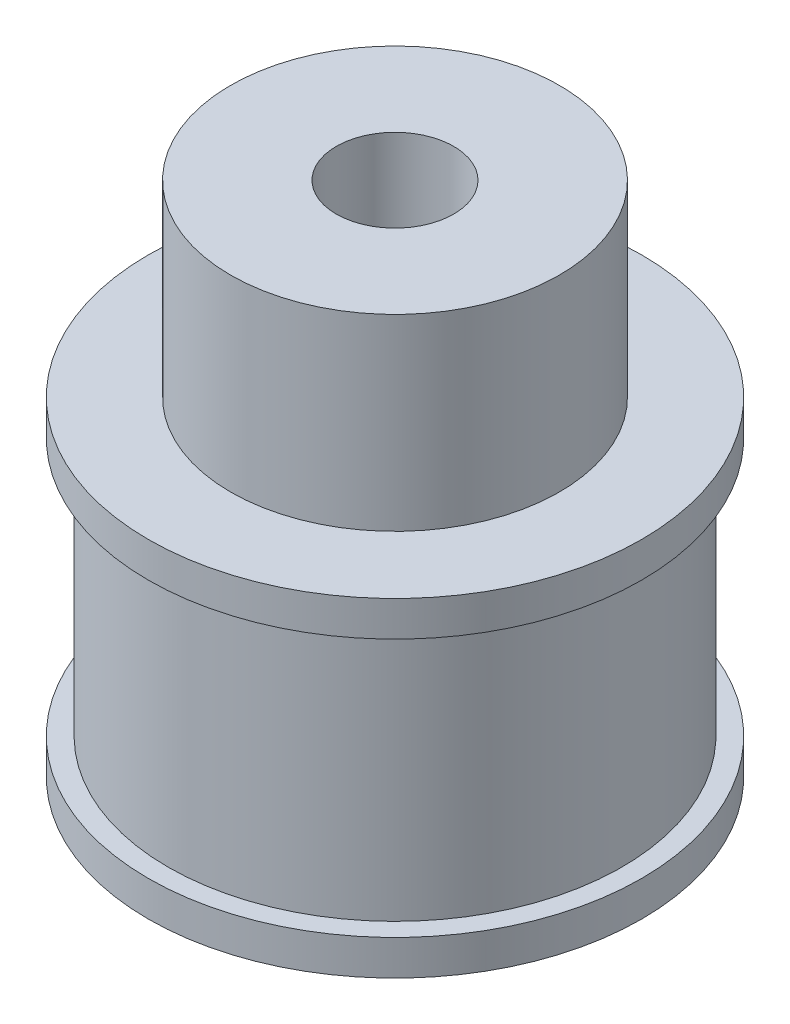
ISO-10303-21;
HEADER;
FILE_DESCRIPTION(('STEP AP214'),'2;1');
FILE_NAME('part.step','',(''),(''),'','','');
FILE_SCHEMA(('AUTOMOTIVE_DESIGN { 1 0 10303 214 1 1 1 1 }'));
ENDSEC;
DATA;
#1=APPLICATION_CONTEXT('core data for automotive mechanical design processes');
#2=APPLICATION_PROTOCOL_DEFINITION('international standard','automotive_design',2000,#1);
#3=PRODUCT_CONTEXT('',#1,'mechanical');
#4=PRODUCT('Part','Part','',(#3));
#5=PRODUCT_RELATED_PRODUCT_CATEGORY('part','',(#4));
#6=PRODUCT_DEFINITION_FORMATION('','',#4);
#7=PRODUCT_DEFINITION_CONTEXT('part definition',#1,'design');
#8=PRODUCT_DEFINITION('design','',#6,#7);
#9=PRODUCT_DEFINITION_SHAPE('','',#8);
#10=(LENGTH_UNIT() NAMED_UNIT(*) SI_UNIT(.MILLI.,.METRE.));
#11=(NAMED_UNIT(*) PLANE_ANGLE_UNIT() SI_UNIT($,.RADIAN.));
#12=(NAMED_UNIT(*) SI_UNIT($,.STERADIAN.) SOLID_ANGLE_UNIT());
#13=UNCERTAINTY_MEASURE_WITH_UNIT(LENGTH_MEASURE(1.E-05),#10,'distance_accuracy_value','');
#14=(GEOMETRIC_REPRESENTATION_CONTEXT(3) GLOBAL_UNCERTAINTY_ASSIGNED_CONTEXT((#13)) GLOBAL_UNIT_ASSIGNED_CONTEXT((#10,
#11,#12)) REPRESENTATION_CONTEXT('',''));
#15=CARTESIAN_POINT('',(0.,0.,0.));
#16=DIRECTION('',(0.,0.,1.));
#17=DIRECTION('',(1.,0.,0.));
#18=AXIS2_PLACEMENT_3D('',#15,#16,#17);
#19=CARTESIAN_POINT('',(0.,14.,0.));
#20=DIRECTION('',(0.,-1.,0.));
#21=DIRECTION('',(0.,0.,-1.));
#22=AXIS2_PLACEMENT_3D('',#19,#20,#21);
#23=CYLINDRICAL_SURFACE('',#22,10.5);
#24=CARTESIAN_POINT('',(0.,0.,0.));
#25=DIRECTION('',(0.,1.,0.));
#26=DIRECTION('',(0.,0.,1.));
#27=AXIS2_PLACEMENT_3D('',#24,#25,#26);
#28=CIRCLE('',#27,10.5);
#29=CARTESIAN_POINT('',(0.,0.,10.5));
#30=VERTEX_POINT('',#29);
#31=EDGE_CURVE('E44',#30,#30,#28,.T.);
#32=ORIENTED_EDGE('',*,*,#31,.T.);
#33=EDGE_LOOP('',(#32));
#34=FACE_BOUND('',#33,.T.);
#35=CARTESIAN_POINT('',(0.,1.5,0.));
#36=DIRECTION('',(0.,1.,0.));
#37=DIRECTION('',(0.,0.,1.));
#38=AXIS2_PLACEMENT_3D('',#35,#36,#37);
#39=CIRCLE('',#38,10.5);
#40=CARTESIAN_POINT('',(0.,1.5,10.5));
#41=VERTEX_POINT('',#40);
#42=EDGE_CURVE('E51',#41,#41,#39,.T.);
#43=ORIENTED_EDGE('',*,*,#42,.F.);
#44=EDGE_LOOP('',(#43));
#45=FACE_BOUND('',#44,.T.);
#46=ADVANCED_FACE('F31',(#34,#45),#23,.T.);
#47=CARTESIAN_POINT('',(0.,12.5,0.));
#48=DIRECTION('',(0.,1.,0.));
#49=DIRECTION('',(0.,0.,1.));
#50=AXIS2_PLACEMENT_3D('',#47,#48,#49);
#51=CIRCLE('',#50,10.5);
#52=CARTESIAN_POINT('',(0.,12.5,10.5));
#53=VERTEX_POINT('',#52);
#54=EDGE_CURVE('E35',#53,#53,#51,.T.);
#55=ORIENTED_EDGE('',*,*,#54,.T.);
#56=EDGE_LOOP('',(#55));
#57=FACE_BOUND('',#56,.T.);
#58=CARTESIAN_POINT('',(0.,14.,0.));
#59=DIRECTION('',(0.,1.,0.));
#60=DIRECTION('',(0.,0.,1.));
#61=AXIS2_PLACEMENT_3D('',#58,#59,#60);
#62=CIRCLE('',#61,10.5);
#63=CARTESIAN_POINT('',(0.,14.,10.5));
#64=VERTEX_POINT('',#63);
#65=EDGE_CURVE('E39',#64,#64,#62,.T.);
#66=ORIENTED_EDGE('',*,*,#65,.F.);
#67=EDGE_LOOP('',(#66));
#68=FACE_BOUND('',#67,.T.);
#69=ADVANCED_FACE('F33',(#57,#68),#23,.T.);
#70=CARTESIAN_POINT('',(0.,14.,0.));
#71=DIRECTION('',(0.,1.,0.));
#72=DIRECTION('',(0.,0.,1.));
#73=AXIS2_PLACEMENT_3D('',#70,#71,#72);
#74=PLANE('',#73);
#75=CARTESIAN_POINT('',(0.,14.,0.));
#76=DIRECTION('',(0.,1.,0.));
#77=DIRECTION('',(0.,0.,1.));
#78=AXIS2_PLACEMENT_3D('',#75,#76,#77);
#79=CIRCLE('',#78,7.);
#80=CARTESIAN_POINT('',(0.,14.,7.));
#81=VERTEX_POINT('',#80);
#82=EDGE_CURVE('E11',#81,#81,#79,.T.);
#83=ORIENTED_EDGE('',*,*,#82,.F.);
#84=EDGE_LOOP('',(#83));
#85=FACE_BOUND('',#84,.T.);
#86=ORIENTED_EDGE('',*,*,#65,.T.);
#87=EDGE_LOOP('',(#86));
#88=FACE_BOUND('',#87,.T.);
#89=ADVANCED_FACE('F87',(#85,#88),#74,.T.);
#90=CARTESIAN_POINT('',(0.,0.,0.));
#91=DIRECTION('',(0.,1.,0.));
#92=DIRECTION('',(0.,0.,1.));
#93=AXIS2_PLACEMENT_3D('',#90,#91,#92);
#94=PLANE('',#93);
#95=CARTESIAN_POINT('',(0.,0.,0.));
#96=DIRECTION('',(0.,1.,0.));
#97=DIRECTION('',(0.,0.,1.));
#98=AXIS2_PLACEMENT_3D('',#95,#96,#97);
#99=CIRCLE('',#98,2.5);
#100=CARTESIAN_POINT('',(0.,0.,2.5));
#101=VERTEX_POINT('',#100);
#102=EDGE_CURVE('E66',#101,#101,#99,.T.);
#103=ORIENTED_EDGE('',*,*,#102,.T.);
#104=EDGE_LOOP('',(#103));
#105=FACE_BOUND('',#104,.T.);
#106=ORIENTED_EDGE('',*,*,#31,.F.);
#107=EDGE_LOOP('',(#106));
#108=FACE_BOUND('',#107,.T.);
#109=ADVANCED_FACE('F82',(#105,#108),#94,.F.);
#110=CARTESIAN_POINT('',(0.,22.,0.));
#111=DIRECTION('',(0.,-1.,0.));
#112=DIRECTION('',(0.,0.,-1.));
#113=AXIS2_PLACEMENT_3D('',#110,#111,#112);
#114=CYLINDRICAL_SURFACE('',#113,7.);
#115=CARTESIAN_POINT('',(0.,22.,0.));
#116=DIRECTION('',(0.,1.,0.));
#117=DIRECTION('',(0.,0.,1.));
#118=AXIS2_PLACEMENT_3D('',#115,#116,#117);
#119=CIRCLE('',#118,7.);
#120=CARTESIAN_POINT('',(0.,22.,7.));
#121=VERTEX_POINT('',#120);
#122=EDGE_CURVE('E47',#121,#121,#119,.T.);
#123=ORIENTED_EDGE('',*,*,#122,.F.);
#124=EDGE_LOOP('',(#123));
#125=FACE_BOUND('',#124,.T.);
#126=ORIENTED_EDGE('',*,*,#82,.T.);
#127=EDGE_LOOP('',(#126));
#128=FACE_BOUND('',#127,.T.);
#129=ADVANCED_FACE('F76',(#125,#128),#114,.T.);
#130=CARTESIAN_POINT('',(0.,22.,0.));
#131=DIRECTION('',(0.,1.,0.));
#132=DIRECTION('',(0.,0.,1.));
#133=AXIS2_PLACEMENT_3D('',#130,#131,#132);
#134=PLANE('',#133);
#135=CARTESIAN_POINT('',(0.,22.,0.));
#136=DIRECTION('',(0.,1.,0.));
#137=DIRECTION('',(0.,0.,1.));
#138=AXIS2_PLACEMENT_3D('',#135,#136,#137);
#139=CIRCLE('',#138,2.5);
#140=CARTESIAN_POINT('',(0.,22.,2.5));
#141=VERTEX_POINT('',#140);
#142=EDGE_CURVE('E57',#141,#141,#139,.T.);
#143=ORIENTED_EDGE('',*,*,#142,.F.);
#144=EDGE_LOOP('',(#143));
#145=FACE_BOUND('',#144,.T.);
#146=ORIENTED_EDGE('',*,*,#122,.T.);
#147=EDGE_LOOP('',(#146));
#148=FACE_BOUND('',#147,.T.);
#149=ADVANCED_FACE('F73',(#145,#148),#134,.T.);
#150=CARTESIAN_POINT('',(0.,0.,0.));
#151=DIRECTION('',(0.,1.,0.));
#152=DIRECTION('',(0.,0.,1.));
#153=AXIS2_PLACEMENT_3D('',#150,#151,#152);
#154=CYLINDRICAL_SURFACE('',#153,2.5);
#155=ORIENTED_EDGE('',*,*,#102,.F.);
#156=EDGE_LOOP('',(#155));
#157=FACE_BOUND('',#156,.T.);
#158=ORIENTED_EDGE('',*,*,#142,.T.);
#159=EDGE_LOOP('',(#158));
#160=FACE_BOUND('',#159,.T.);
#161=ADVANCED_FACE('F71',(#157,#160),#154,.F.);
#162=CARTESIAN_POINT('',(0.,12.5,0.));
#163=DIRECTION('',(0.,1.,0.));
#164=DIRECTION('',(0.,0.,1.));
#165=AXIS2_PLACEMENT_3D('',#162,#163,#164);
#166=PLANE('',#165);
#167=CARTESIAN_POINT('',(0.,12.5,0.));
#168=DIRECTION('',(0.,1.,0.));
#169=DIRECTION('',(0.,0.,1.));
#170=AXIS2_PLACEMENT_3D('',#167,#168,#169);
#171=CIRCLE('',#170,9.6623253001789);
#172=CARTESIAN_POINT('',(0.,12.5,9.6623253001789));
#173=VERTEX_POINT('',#172);
#174=EDGE_CURVE('E53',#173,#173,#171,.T.);
#175=ORIENTED_EDGE('',*,*,#174,.T.);
#176=EDGE_LOOP('',(#175));
#177=FACE_BOUND('',#176,.T.);
#178=ORIENTED_EDGE('',*,*,#54,.F.);
#179=EDGE_LOOP('',(#178));
#180=FACE_BOUND('',#179,.T.);
#181=ADVANCED_FACE('F108',(#177,#180),#166,.F.);
#182=CARTESIAN_POINT('',(0.,1.5,0.));
#183=DIRECTION('',(0.,1.,0.));
#184=DIRECTION('',(0.,0.,1.));
#185=AXIS2_PLACEMENT_3D('',#182,#183,#184);
#186=PLANE('',#185);
#187=CARTESIAN_POINT('',(0.,1.5,0.));
#188=DIRECTION('',(0.,1.,0.));
#189=DIRECTION('',(0.,0.,1.));
#190=AXIS2_PLACEMENT_3D('',#187,#188,#189);
#191=CIRCLE('',#190,9.6623253001789);
#192=CARTESIAN_POINT('',(0.,1.5,9.6623253001789));
#193=VERTEX_POINT('',#192);
#194=EDGE_CURVE('E59',#193,#193,#191,.T.);
#195=ORIENTED_EDGE('',*,*,#194,.F.);
#196=EDGE_LOOP('',(#195));
#197=FACE_BOUND('',#196,.T.);
#198=ORIENTED_EDGE('',*,*,#42,.T.);
#199=EDGE_LOOP('',(#198));
#200=FACE_BOUND('',#199,.T.);
#201=ADVANCED_FACE('F110',(#197,#200),#186,.T.);
#202=CARTESIAN_POINT('',(0.,12.5,0.));
#203=DIRECTION('',(0.,-1.,0.));
#204=DIRECTION('',(0.,0.,-1.));
#205=AXIS2_PLACEMENT_3D('',#202,#203,#204);
#206=CYLINDRICAL_SURFACE('',#205,9.6623253001789);
#207=ORIENTED_EDGE('',*,*,#174,.F.);
#208=EDGE_LOOP('',(#207));
#209=FACE_BOUND('',#208,.T.);
#210=ORIENTED_EDGE('',*,*,#194,.T.);
#211=EDGE_LOOP('',(#210));
#212=FACE_BOUND('',#211,.T.);
#213=ADVANCED_FACE('F116',(#209,#212),#206,.T.);
#214=CLOSED_SHELL('',(#46,#69,#89,#109,#129,#149,#161,#181,#201,#213));
#215=MANIFOLD_SOLID_BREP('B2',#214);
#216=ADVANCED_BREP_SHAPE_REPRESENTATION('',(#18,#215),#14);
#217=SHAPE_DEFINITION_REPRESENTATION(#9,#216);
ENDSEC;
END-ISO-10303-21;
